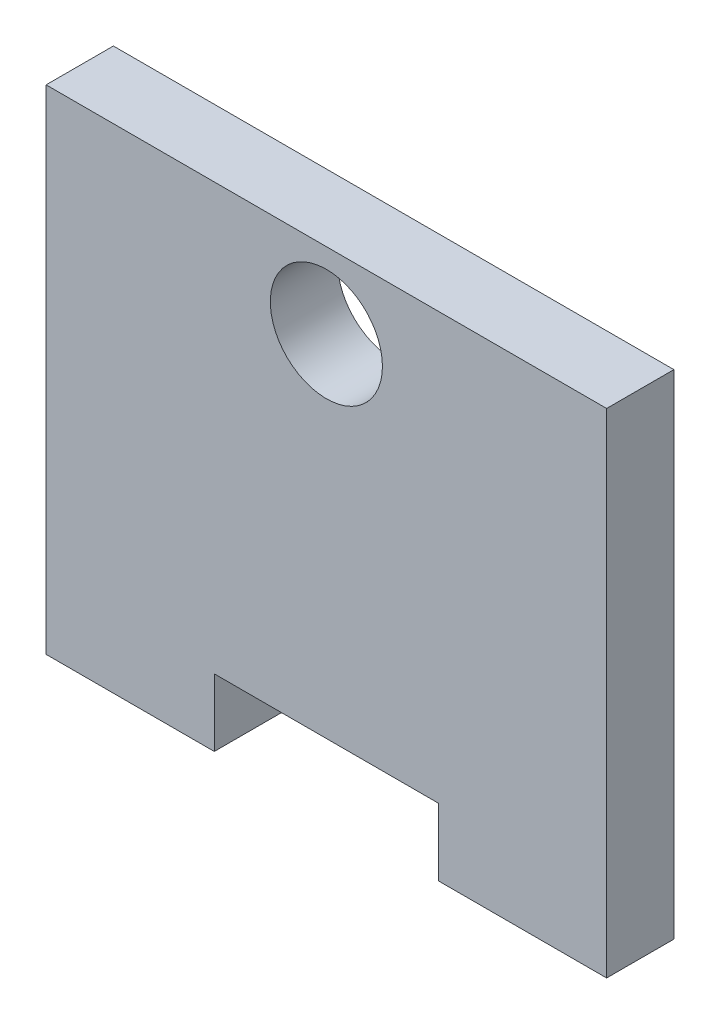
ISO-10303-21;
HEADER;
FILE_DESCRIPTION(('STEP AP214'),'2;1');
FILE_NAME('part.step','',(''),(''),'','','');
FILE_SCHEMA(('AUTOMOTIVE_DESIGN { 1 0 10303 214 1 1 1 1 }'));
ENDSEC;
DATA;
#1=APPLICATION_CONTEXT('core data for automotive mechanical design processes');
#2=APPLICATION_PROTOCOL_DEFINITION('international standard','automotive_design',2000,#1);
#3=PRODUCT_CONTEXT('',#1,'mechanical');
#4=PRODUCT('Part','Part','',(#3));
#5=PRODUCT_RELATED_PRODUCT_CATEGORY('part','',(#4));
#6=PRODUCT_DEFINITION_FORMATION('','',#4);
#7=PRODUCT_DEFINITION_CONTEXT('part definition',#1,'design');
#8=PRODUCT_DEFINITION('design','',#6,#7);
#9=PRODUCT_DEFINITION_SHAPE('','',#8);
#10=(LENGTH_UNIT() NAMED_UNIT(*) SI_UNIT(.MILLI.,.METRE.));
#11=(NAMED_UNIT(*) PLANE_ANGLE_UNIT() SI_UNIT($,.RADIAN.));
#12=(NAMED_UNIT(*) SI_UNIT($,.STERADIAN.) SOLID_ANGLE_UNIT());
#13=UNCERTAINTY_MEASURE_WITH_UNIT(LENGTH_MEASURE(1.E-05),#10,'distance_accuracy_value','');
#14=(GEOMETRIC_REPRESENTATION_CONTEXT(3) GLOBAL_UNCERTAINTY_ASSIGNED_CONTEXT((#13)) GLOBAL_UNIT_ASSIGNED_CONTEXT((#10,
#11,#12)) REPRESENTATION_CONTEXT('',''));
#15=CARTESIAN_POINT('',(0.,0.,0.));
#16=DIRECTION('',(0.,0.,1.));
#17=DIRECTION('',(1.,0.,0.));
#18=AXIS2_PLACEMENT_3D('',#15,#16,#17);
#19=CARTESIAN_POINT('',(0.,0.,6.));
#20=DIRECTION('',(0.,0.,1.));
#21=DIRECTION('',(1.,0.,0.));
#22=AXIS2_PLACEMENT_3D('',#19,#20,#21);
#23=PLANE('',#22);
#24=DIRECTION('',(0.,-1.,0.));
#25=VECTOR('',#24,1.);
#26=CARTESIAN_POINT('',(0.,0.,6.));
#27=LINE('',#26,#25);
#28=CARTESIAN_POINT('',(0.,38.,6.));
#29=VERTEX_POINT('',#28);
#30=CARTESIAN_POINT('',(0.,-6.,6.));
#31=VERTEX_POINT('',#30);
#32=EDGE_CURVE('E53',#29,#31,#27,.T.);
#33=ORIENTED_EDGE('',*,*,#32,.T.);
#34=DIRECTION('',(1.,0.,0.));
#35=VECTOR('',#34,1.);
#36=CARTESIAN_POINT('',(0.,-6.,6.));
#37=LINE('',#36,#35);
#38=CARTESIAN_POINT('',(15.,-6.,6.));
#39=VERTEX_POINT('',#38);
#40=EDGE_CURVE('E96',#31,#39,#37,.T.);
#41=ORIENTED_EDGE('',*,*,#40,.T.);
#42=DIRECTION('',(0.,1.,0.));
#43=VECTOR('',#42,1.);
#44=CARTESIAN_POINT('',(15.,0.,6.));
#45=LINE('',#44,#43);
#46=CARTESIAN_POINT('',(15.,0.,6.));
#47=VERTEX_POINT('',#46);
#48=EDGE_CURVE('E165',#39,#47,#45,.T.);
#49=ORIENTED_EDGE('',*,*,#48,.T.);
#50=DIRECTION('',(1.,0.,0.));
#51=VECTOR('',#50,1.);
#52=CARTESIAN_POINT('',(15.,0.,6.));
#53=LINE('',#52,#51);
#54=CARTESIAN_POINT('',(35.,0.,6.));
#55=VERTEX_POINT('',#54);
#56=EDGE_CURVE('E179',#47,#55,#53,.T.);
#57=ORIENTED_EDGE('',*,*,#56,.T.);
#58=DIRECTION('',(0.,-1.,0.));
#59=VECTOR('',#58,1.);
#60=CARTESIAN_POINT('',(35.,0.,6.));
#61=LINE('',#60,#59);
#62=CARTESIAN_POINT('',(35.,-6.,6.));
#63=VERTEX_POINT('',#62);
#64=EDGE_CURVE('E116',#55,#63,#61,.T.);
#65=ORIENTED_EDGE('',*,*,#64,.T.);
#66=DIRECTION('',(1.,0.,0.));
#67=VECTOR('',#66,1.);
#68=CARTESIAN_POINT('',(50.,-5.99999999999999,6.));
#69=LINE('',#68,#67);
#70=CARTESIAN_POINT('',(50.,-5.99999999999999,6.));
#71=VERTEX_POINT('',#70);
#72=EDGE_CURVE('E110',#63,#71,#69,.T.);
#73=ORIENTED_EDGE('',*,*,#72,.T.);
#74=DIRECTION('',(0.,1.,0.));
#75=VECTOR('',#74,1.);
#76=CARTESIAN_POINT('',(50.,0.,6.));
#77=LINE('',#76,#75);
#78=CARTESIAN_POINT('',(50.,38.,6.));
#79=VERTEX_POINT('',#78);
#80=EDGE_CURVE('E114',#71,#79,#77,.T.);
#81=ORIENTED_EDGE('',*,*,#80,.T.);
#82=DIRECTION('',(-1.,0.,0.));
#83=VECTOR('',#82,1.);
#84=CARTESIAN_POINT('',(50.,38.,6.));
#85=LINE('',#84,#83);
#86=EDGE_CURVE('E131',#79,#29,#85,.T.);
#87=ORIENTED_EDGE('',*,*,#86,.T.);
#88=EDGE_LOOP('',(#33,#41,#49,#57,#65,#73,#81,#87));
#89=FACE_BOUND('',#88,.T.);
#90=CARTESIAN_POINT('',(25.,31.25,6.));
#91=DIRECTION('',(0.,0.,1.));
#92=DIRECTION('',(1.,0.,0.));
#93=AXIS2_PLACEMENT_3D('',#90,#91,#92);
#94=CIRCLE('',#93,5.);
#95=CARTESIAN_POINT('',(30.,31.25,6.));
#96=VERTEX_POINT('',#95);
#97=EDGE_CURVE('E140',#96,#96,#94,.T.);
#98=ORIENTED_EDGE('',*,*,#97,.F.);
#99=EDGE_LOOP('',(#98));
#100=FACE_BOUND('',#99,.T.);
#101=ADVANCED_FACE('F36',(#89,#100),#23,.T.);
#102=CARTESIAN_POINT('',(0.,0.,0.));
#103=DIRECTION('',(0.,0.,1.));
#104=DIRECTION('',(1.,0.,0.));
#105=AXIS2_PLACEMENT_3D('',#102,#103,#104);
#106=PLANE('',#105);
#107=DIRECTION('',(1.,0.,0.));
#108=VECTOR('',#107,1.);
#109=CARTESIAN_POINT('',(0.,-6.,0.));
#110=LINE('',#109,#108);
#111=CARTESIAN_POINT('',(0.,-6.,0.));
#112=VERTEX_POINT('',#111);
#113=CARTESIAN_POINT('',(15.,-6.,0.));
#114=VERTEX_POINT('',#113);
#115=EDGE_CURVE('E137',#112,#114,#110,.T.);
#116=ORIENTED_EDGE('',*,*,#115,.F.);
#117=DIRECTION('',(0.,-1.,0.));
#118=VECTOR('',#117,1.);
#119=CARTESIAN_POINT('',(0.,38.,0.));
#120=LINE('',#119,#118);
#121=CARTESIAN_POINT('',(0.,38.,0.));
#122=VERTEX_POINT('',#121);
#123=EDGE_CURVE('E149',#122,#112,#120,.T.);
#124=ORIENTED_EDGE('',*,*,#123,.F.);
#125=DIRECTION('',(-1.,0.,0.));
#126=VECTOR('',#125,1.);
#127=CARTESIAN_POINT('',(50.,38.,0.));
#128=LINE('',#127,#126);
#129=CARTESIAN_POINT('',(50.,38.,0.));
#130=VERTEX_POINT('',#129);
#131=EDGE_CURVE('E89',#130,#122,#128,.T.);
#132=ORIENTED_EDGE('',*,*,#131,.F.);
#133=DIRECTION('',(0.,1.,0.));
#134=VECTOR('',#133,1.);
#135=CARTESIAN_POINT('',(50.,0.,0.));
#136=LINE('',#135,#134);
#137=CARTESIAN_POINT('',(50.,-5.99999999999999,0.));
#138=VERTEX_POINT('',#137);
#139=EDGE_CURVE('E82',#138,#130,#136,.T.);
#140=ORIENTED_EDGE('',*,*,#139,.F.);
#141=DIRECTION('',(1.,0.,0.));
#142=VECTOR('',#141,1.);
#143=CARTESIAN_POINT('',(50.,-5.99999999999999,0.));
#144=LINE('',#143,#142);
#145=CARTESIAN_POINT('',(35.,-6.,0.));
#146=VERTEX_POINT('',#145);
#147=EDGE_CURVE('E125',#146,#138,#144,.T.);
#148=ORIENTED_EDGE('',*,*,#147,.F.);
#149=DIRECTION('',(0.,-1.,0.));
#150=VECTOR('',#149,1.);
#151=CARTESIAN_POINT('',(35.,0.,0.));
#152=LINE('',#151,#150);
#153=CARTESIAN_POINT('',(35.,0.,0.));
#154=VERTEX_POINT('',#153);
#155=EDGE_CURVE('E144',#154,#146,#152,.T.);
#156=ORIENTED_EDGE('',*,*,#155,.F.);
#157=DIRECTION('',(1.,0.,0.));
#158=VECTOR('',#157,1.);
#159=CARTESIAN_POINT('',(15.,0.,0.));
#160=LINE('',#159,#158);
#161=CARTESIAN_POINT('',(15.,0.,0.));
#162=VERTEX_POINT('',#161);
#163=EDGE_CURVE('E142',#162,#154,#160,.T.);
#164=ORIENTED_EDGE('',*,*,#163,.F.);
#165=DIRECTION('',(0.,1.,0.));
#166=VECTOR('',#165,1.);
#167=CARTESIAN_POINT('',(15.,0.,0.));
#168=LINE('',#167,#166);
#169=EDGE_CURVE('E139',#114,#162,#168,.T.);
#170=ORIENTED_EDGE('',*,*,#169,.F.);
#171=EDGE_LOOP('',(#116,#124,#132,#140,#148,#156,#164,#170));
#172=FACE_BOUND('',#171,.T.);
#173=CARTESIAN_POINT('',(25.,31.25,0.));
#174=DIRECTION('',(0.,0.,1.));
#175=DIRECTION('',(1.,0.,0.));
#176=AXIS2_PLACEMENT_3D('',#173,#174,#175);
#177=CIRCLE('',#176,5.);
#178=CARTESIAN_POINT('',(30.,31.25,0.));
#179=VERTEX_POINT('',#178);
#180=EDGE_CURVE('E185',#179,#179,#177,.T.);
#181=ORIENTED_EDGE('',*,*,#180,.T.);
#182=EDGE_LOOP('',(#181));
#183=FACE_BOUND('',#182,.T.);
#184=ADVANCED_FACE('F169',(#172,#183),#106,.F.);
#185=CARTESIAN_POINT('',(0.,-6.,6.));
#186=DIRECTION('',(0.,1.,0.));
#187=DIRECTION('',(0.,0.,1.));
#188=AXIS2_PLACEMENT_3D('',#185,#186,#187);
#189=PLANE('',#188);
#190=ORIENTED_EDGE('',*,*,#115,.T.);
#191=DIRECTION('',(0.,0.,-1.));
#192=VECTOR('',#191,1.);
#193=CARTESIAN_POINT('',(15.,-6.,6.));
#194=LINE('',#193,#192);
#195=EDGE_CURVE('E45',#39,#114,#194,.T.);
#196=ORIENTED_EDGE('',*,*,#195,.F.);
#197=ORIENTED_EDGE('',*,*,#40,.F.);
#198=DIRECTION('',(0.,0.,-1.));
#199=VECTOR('',#198,1.);
#200=CARTESIAN_POINT('',(0.,-6.,6.));
#201=LINE('',#200,#199);
#202=EDGE_CURVE('E11',#31,#112,#201,.T.);
#203=ORIENTED_EDGE('',*,*,#202,.T.);
#204=EDGE_LOOP('',(#190,#196,#197,#203));
#205=FACE_BOUND('',#204,.T.);
#206=ADVANCED_FACE('F38',(#205),#189,.F.);
#207=CARTESIAN_POINT('',(15.,0.,6.));
#208=DIRECTION('',(-1.,0.,0.));
#209=DIRECTION('',(0.,0.,1.));
#210=AXIS2_PLACEMENT_3D('',#207,#208,#209);
#211=PLANE('',#210);
#212=ORIENTED_EDGE('',*,*,#169,.T.);
#213=DIRECTION('',(0.,0.,-1.));
#214=VECTOR('',#213,1.);
#215=CARTESIAN_POINT('',(15.,0.,6.));
#216=LINE('',#215,#214);
#217=EDGE_CURVE('E157',#47,#162,#216,.T.);
#218=ORIENTED_EDGE('',*,*,#217,.F.);
#219=ORIENTED_EDGE('',*,*,#48,.F.);
#220=ORIENTED_EDGE('',*,*,#195,.T.);
#221=EDGE_LOOP('',(#212,#218,#219,#220));
#222=FACE_BOUND('',#221,.T.);
#223=ADVANCED_FACE('F163',(#222),#211,.F.);
#224=CARTESIAN_POINT('',(15.,0.,6.));
#225=DIRECTION('',(0.,1.,0.));
#226=DIRECTION('',(-1.,0.,0.));
#227=AXIS2_PLACEMENT_3D('',#224,#225,#226);
#228=PLANE('',#227);
#229=ORIENTED_EDGE('',*,*,#163,.T.);
#230=DIRECTION('',(0.,0.,-1.));
#231=VECTOR('',#230,1.);
#232=CARTESIAN_POINT('',(35.,0.,6.));
#233=LINE('',#232,#231);
#234=EDGE_CURVE('E154',#55,#154,#233,.T.);
#235=ORIENTED_EDGE('',*,*,#234,.F.);
#236=ORIENTED_EDGE('',*,*,#56,.F.);
#237=ORIENTED_EDGE('',*,*,#217,.T.);
#238=EDGE_LOOP('',(#229,#235,#236,#237));
#239=FACE_BOUND('',#238,.T.);
#240=ADVANCED_FACE('F175',(#239),#228,.F.);
#241=CARTESIAN_POINT('',(35.,0.,6.));
#242=DIRECTION('',(1.,0.,0.));
#243=DIRECTION('',(0.,0.,-1.));
#244=AXIS2_PLACEMENT_3D('',#241,#242,#243);
#245=PLANE('',#244);
#246=ORIENTED_EDGE('',*,*,#155,.T.);
#247=DIRECTION('',(0.,0.,-1.));
#248=VECTOR('',#247,1.);
#249=CARTESIAN_POINT('',(35.,-6.,6.));
#250=LINE('',#249,#248);
#251=EDGE_CURVE('E126',#63,#146,#250,.T.);
#252=ORIENTED_EDGE('',*,*,#251,.F.);
#253=ORIENTED_EDGE('',*,*,#64,.F.);
#254=ORIENTED_EDGE('',*,*,#234,.T.);
#255=EDGE_LOOP('',(#246,#252,#253,#254));
#256=FACE_BOUND('',#255,.T.);
#257=ADVANCED_FACE('F178',(#256),#245,.F.);
#258=CARTESIAN_POINT('',(50.,-5.99999999999999,6.));
#259=DIRECTION('',(0.,1.,0.));
#260=DIRECTION('',(-1.,0.,0.));
#261=AXIS2_PLACEMENT_3D('',#258,#259,#260);
#262=PLANE('',#261);
#263=ORIENTED_EDGE('',*,*,#147,.T.);
#264=DIRECTION('',(0.,0.,-1.));
#265=VECTOR('',#264,1.);
#266=CARTESIAN_POINT('',(50.,-5.99999999999999,6.));
#267=LINE('',#266,#265);
#268=EDGE_CURVE('E122',#71,#138,#267,.T.);
#269=ORIENTED_EDGE('',*,*,#268,.F.);
#270=ORIENTED_EDGE('',*,*,#72,.F.);
#271=ORIENTED_EDGE('',*,*,#251,.T.);
#272=EDGE_LOOP('',(#263,#269,#270,#271));
#273=FACE_BOUND('',#272,.T.);
#274=ADVANCED_FACE('F123',(#273),#262,.F.);
#275=CARTESIAN_POINT('',(50.,0.,6.));
#276=DIRECTION('',(-1.,0.,0.));
#277=DIRECTION('',(0.,-1.,0.));
#278=AXIS2_PLACEMENT_3D('',#275,#276,#277);
#279=PLANE('',#278);
#280=ORIENTED_EDGE('',*,*,#139,.T.);
#281=DIRECTION('',(0.,0.,-1.));
#282=VECTOR('',#281,1.);
#283=CARTESIAN_POINT('',(50.,38.,6.));
#284=LINE('',#283,#282);
#285=EDGE_CURVE('E127',#79,#130,#284,.T.);
#286=ORIENTED_EDGE('',*,*,#285,.F.);
#287=ORIENTED_EDGE('',*,*,#80,.F.);
#288=ORIENTED_EDGE('',*,*,#268,.T.);
#289=EDGE_LOOP('',(#280,#286,#287,#288));
#290=FACE_BOUND('',#289,.T.);
#291=ADVANCED_FACE('F129',(#290),#279,.F.);
#292=CARTESIAN_POINT('',(50.,38.,6.));
#293=DIRECTION('',(0.,-1.,0.));
#294=DIRECTION('',(0.,0.,-1.));
#295=AXIS2_PLACEMENT_3D('',#292,#293,#294);
#296=PLANE('',#295);
#297=ORIENTED_EDGE('',*,*,#131,.T.);
#298=DIRECTION('',(0.,0.,-1.));
#299=VECTOR('',#298,1.);
#300=CARTESIAN_POINT('',(0.,38.,6.));
#301=LINE('',#300,#299);
#302=EDGE_CURVE('E133',#29,#122,#301,.T.);
#303=ORIENTED_EDGE('',*,*,#302,.F.);
#304=ORIENTED_EDGE('',*,*,#86,.F.);
#305=ORIENTED_EDGE('',*,*,#285,.T.);
#306=EDGE_LOOP('',(#297,#303,#304,#305));
#307=FACE_BOUND('',#306,.T.);
#308=ADVANCED_FACE('F204',(#307),#296,.F.);
#309=CARTESIAN_POINT('',(0.,38.,6.));
#310=DIRECTION('',(1.,0.,0.));
#311=DIRECTION('',(0.,1.,0.));
#312=AXIS2_PLACEMENT_3D('',#309,#310,#311);
#313=PLANE('',#312);
#314=ORIENTED_EDGE('',*,*,#123,.T.);
#315=ORIENTED_EDGE('',*,*,#202,.F.);
#316=ORIENTED_EDGE('',*,*,#32,.F.);
#317=ORIENTED_EDGE('',*,*,#302,.T.);
#318=EDGE_LOOP('',(#314,#315,#316,#317));
#319=FACE_BOUND('',#318,.T.);
#320=ADVANCED_FACE('F201',(#319),#313,.F.);
#321=CARTESIAN_POINT('',(25.,31.25,6.));
#322=DIRECTION('',(0.,0.,-1.));
#323=DIRECTION('',(-1.,0.,0.));
#324=AXIS2_PLACEMENT_3D('',#321,#322,#323);
#325=CYLINDRICAL_SURFACE('',#324,5.);
#326=ORIENTED_EDGE('',*,*,#97,.T.);
#327=EDGE_LOOP('',(#326));
#328=FACE_BOUND('',#327,.T.);
#329=ORIENTED_EDGE('',*,*,#180,.F.);
#330=EDGE_LOOP('',(#329));
#331=FACE_BOUND('',#330,.T.);
#332=ADVANCED_FACE('F191',(#328,#331),#325,.F.);
#333=CLOSED_SHELL('',(#101,#184,#206,#223,#240,#257,#274,#291,#308,#320,#332));
#334=MANIFOLD_SOLID_BREP('B2',#333);
#335=ADVANCED_BREP_SHAPE_REPRESENTATION('',(#18,#334),#14);
#336=SHAPE_DEFINITION_REPRESENTATION(#9,#335);
ENDSEC;
END-ISO-10303-21;
